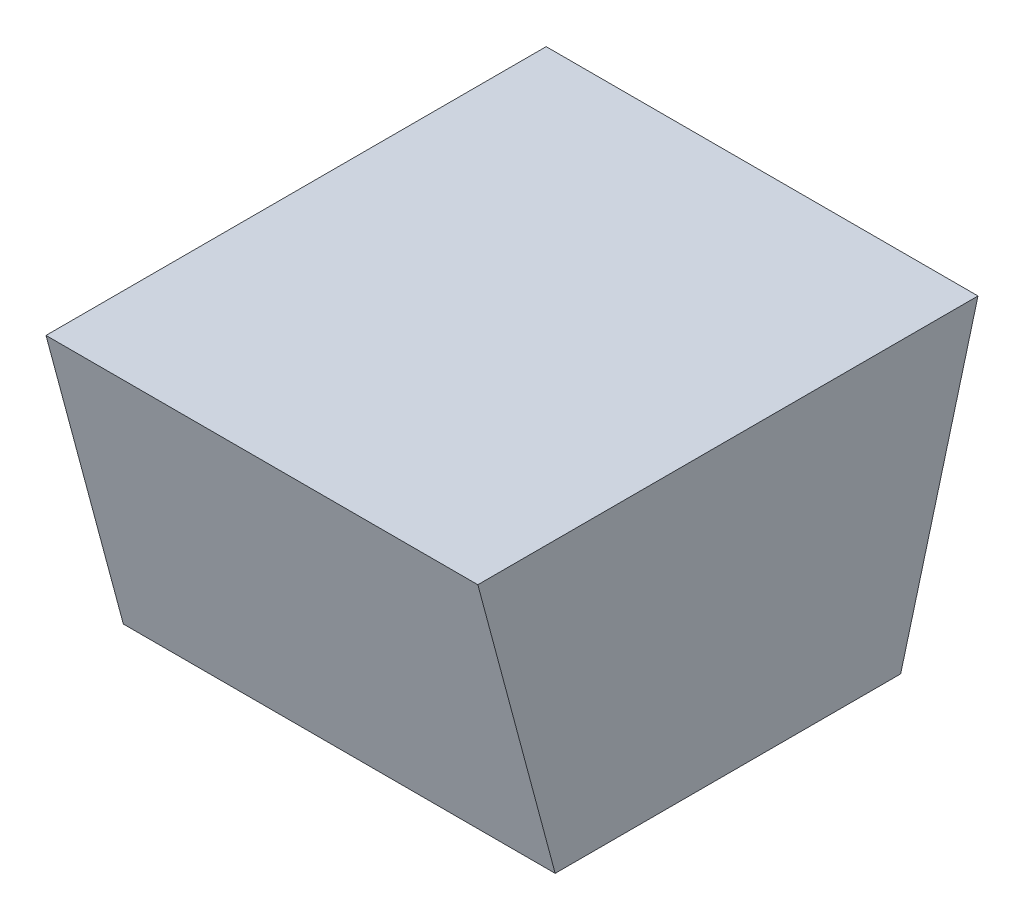
ISO-10303-21;
HEADER;
FILE_DESCRIPTION(('STEP AP214'),'2;1');
FILE_NAME('part.step','',(''),(''),'','','');
FILE_SCHEMA(('AUTOMOTIVE_DESIGN { 1 0 10303 214 1 1 1 1 }'));
ENDSEC;
DATA;
#1=APPLICATION_CONTEXT('core data for automotive mechanical design processes');
#2=APPLICATION_PROTOCOL_DEFINITION('international standard','automotive_design',2000,#1);
#3=PRODUCT_CONTEXT('',#1,'mechanical');
#4=PRODUCT('Part','Part','',(#3));
#5=PRODUCT_RELATED_PRODUCT_CATEGORY('part','',(#4));
#6=PRODUCT_DEFINITION_FORMATION('','',#4);
#7=PRODUCT_DEFINITION_CONTEXT('part definition',#1,'design');
#8=PRODUCT_DEFINITION('design','',#6,#7);
#9=PRODUCT_DEFINITION_SHAPE('','',#8);
#10=(LENGTH_UNIT() NAMED_UNIT(*) SI_UNIT(.MILLI.,.METRE.));
#11=(NAMED_UNIT(*) PLANE_ANGLE_UNIT() SI_UNIT($,.RADIAN.));
#12=(NAMED_UNIT(*) SI_UNIT($,.STERADIAN.) SOLID_ANGLE_UNIT());
#13=UNCERTAINTY_MEASURE_WITH_UNIT(LENGTH_MEASURE(1.E-05),#10,'distance_accuracy_value','');
#14=(GEOMETRIC_REPRESENTATION_CONTEXT(3) GLOBAL_UNCERTAINTY_ASSIGNED_CONTEXT((#13)) GLOBAL_UNIT_ASSIGNED_CONTEXT((#10,
#11,#12)) REPRESENTATION_CONTEXT('',''));
#15=CARTESIAN_POINT('',(0.,0.,0.));
#16=DIRECTION('',(0.,0.,1.));
#17=DIRECTION('',(1.,0.,0.));
#18=AXIS2_PLACEMENT_3D('',#15,#16,#17);
#19=CARTESIAN_POINT('',(0.,0.835526315789467,0.));
#20=DIRECTION('',(0.,1.,0.));
#21=DIRECTION('',(0.,0.,1.));
#22=AXIS2_PLACEMENT_3D('',#19,#20,#21);
#23=PLANE('',#22);
#24=DIRECTION('',(0.,0.,-1.));
#25=VECTOR('',#24,1.);
#26=CARTESIAN_POINT('',(-0.202499976,0.835526315789467,2.007499922));
#27=LINE('',#26,#25);
#28=CARTESIAN_POINT('',(-0.202499976,0.835526315789467,0.72387861757074));
#29=VERTEX_POINT('',#28);
#30=CARTESIAN_POINT('',(-0.202499976,0.835526315789467,-0.72387861757074));
#31=VERTEX_POINT('',#30);
#32=EDGE_CURVE('E101',#29,#31,#27,.T.);
#33=ORIENTED_EDGE('',*,*,#32,.F.);
#34=DIRECTION('',(-1.,0.,0.));
#35=VECTOR('',#34,1.);
#36=CARTESIAN_POINT('',(2.007499922,0.835526315789467,0.72387861757074));
#37=LINE('',#36,#35);
#38=CARTESIAN_POINT('',(1.047500064,0.835526315789467,0.72387861757074));
#39=VERTEX_POINT('',#38);
#40=EDGE_CURVE('E57',#39,#29,#37,.T.);
#41=ORIENTED_EDGE('',*,*,#40,.F.);
#42=DIRECTION('',(0.,0.,1.));
#43=VECTOR('',#42,1.);
#44=CARTESIAN_POINT('',(1.047500064,0.835526315789467,2.007499922));
#45=LINE('',#44,#43);
#46=CARTESIAN_POINT('',(1.047500064,0.835526315789467,-0.72387861757074));
#47=VERTEX_POINT('',#46);
#48=EDGE_CURVE('E12',#47,#39,#45,.T.);
#49=ORIENTED_EDGE('',*,*,#48,.F.);
#50=DIRECTION('',(1.,0.,0.));
#51=VECTOR('',#50,1.);
#52=CARTESIAN_POINT('',(2.007499922,0.835526315789467,-0.72387861757074));
#53=LINE('',#52,#51);
#54=EDGE_CURVE('E81',#31,#47,#53,.T.);
#55=ORIENTED_EDGE('',*,*,#54,.F.);
#56=EDGE_LOOP('',(#33,#41,#49,#55));
#57=FACE_BOUND('',#56,.T.);
#58=ADVANCED_FACE('F42',(#57),#23,.T.);
#59=CARTESIAN_POINT('',(2.007499922,0.,0.500000016));
#60=DIRECTION('',(0.,-0.258819045102522,0.965925826289068));
#61=DIRECTION('',(0.,-0.965925826289068,-0.258819045102522));
#62=AXIS2_PLACEMENT_3D('',#59,#60,#61);
#63=PLANE('',#62);
#64=DIRECTION('',(0.,0.965925826289068,0.258819045102522));
#65=VECTOR('',#64,1.);
#66=CARTESIAN_POINT('',(1.047500064,0.,0.500000016));
#67=LINE('',#66,#65);
#68=CARTESIAN_POINT('',(1.047500064,0.,0.500000016));
#69=VERTEX_POINT('',#68);
#70=EDGE_CURVE('E97',#69,#39,#67,.T.);
#71=ORIENTED_EDGE('',*,*,#70,.T.);
#72=ORIENTED_EDGE('',*,*,#40,.T.);
#73=DIRECTION('',(0.,-0.965925826289068,-0.258819045102522));
#74=VECTOR('',#73,1.);
#75=CARTESIAN_POINT('',(-0.202499976,0.,0.500000016));
#76=LINE('',#75,#74);
#77=CARTESIAN_POINT('',(-0.202499976,0.,0.500000016));
#78=VERTEX_POINT('',#77);
#79=EDGE_CURVE('E108',#29,#78,#76,.T.);
#80=ORIENTED_EDGE('',*,*,#79,.T.);
#81=DIRECTION('',(-1.,0.,0.));
#82=VECTOR('',#81,1.);
#83=CARTESIAN_POINT('',(2.007499922,0.,0.500000016));
#84=LINE('',#83,#82);
#85=EDGE_CURVE('E64',#69,#78,#84,.T.);
#86=ORIENTED_EDGE('',*,*,#85,.F.);
#87=EDGE_LOOP('',(#71,#72,#80,#86));
#88=FACE_BOUND('',#87,.T.);
#89=ADVANCED_FACE('F121',(#88),#63,.T.);
#90=CARTESIAN_POINT('',(2.007499922,0.,-0.500000016));
#91=DIRECTION('',(0.,-0.258819045102522,-0.965925826289068));
#92=DIRECTION('',(0.,0.965925826289068,-0.258819045102522));
#93=AXIS2_PLACEMENT_3D('',#90,#91,#92);
#94=PLANE('',#93);
#95=DIRECTION('',(0.,0.965925826289068,-0.258819045102522));
#96=VECTOR('',#95,1.);
#97=CARTESIAN_POINT('',(-0.202499976,0.,-0.500000016));
#98=LINE('',#97,#96);
#99=CARTESIAN_POINT('',(-0.202499976,0.,-0.500000016));
#100=VERTEX_POINT('',#99);
#101=EDGE_CURVE('E91',#100,#31,#98,.T.);
#102=ORIENTED_EDGE('',*,*,#101,.T.);
#103=ORIENTED_EDGE('',*,*,#54,.T.);
#104=DIRECTION('',(0.,-0.965925826289068,0.258819045102522));
#105=VECTOR('',#104,1.);
#106=CARTESIAN_POINT('',(1.047500064,0.,-0.500000016));
#107=LINE('',#106,#105);
#108=CARTESIAN_POINT('',(1.047500064,0.,-0.500000016));
#109=VERTEX_POINT('',#108);
#110=EDGE_CURVE('E88',#47,#109,#107,.T.);
#111=ORIENTED_EDGE('',*,*,#110,.T.);
#112=DIRECTION('',(-1.,0.,0.));
#113=VECTOR('',#112,1.);
#114=CARTESIAN_POINT('',(2.007499922,0.,-0.500000016));
#115=LINE('',#114,#113);
#116=EDGE_CURVE('E50',#109,#100,#115,.T.);
#117=ORIENTED_EDGE('',*,*,#116,.T.);
#118=EDGE_LOOP('',(#102,#103,#111,#117));
#119=FACE_BOUND('',#118,.T.);
#120=ADVANCED_FACE('F87',(#119),#94,.T.);
#121=CARTESIAN_POINT('',(-0.202499976,1.61600007,2.007499922));
#122=DIRECTION('',(-1.,0.,0.));
#123=DIRECTION('',(0.,-1.,0.));
#124=AXIS2_PLACEMENT_3D('',#121,#122,#123);
#125=PLANE('',#124);
#126=ORIENTED_EDGE('',*,*,#79,.F.);
#127=ORIENTED_EDGE('',*,*,#32,.T.);
#128=ORIENTED_EDGE('',*,*,#101,.F.);
#129=DIRECTION('',(0.,0.,-1.));
#130=VECTOR('',#129,1.);
#131=CARTESIAN_POINT('',(-0.202499976,0.,0.500000016));
#132=LINE('',#131,#130);
#133=EDGE_CURVE('E99',#78,#100,#132,.T.);
#134=ORIENTED_EDGE('',*,*,#133,.F.);
#135=EDGE_LOOP('',(#126,#127,#128,#134));
#136=FACE_BOUND('',#135,.T.);
#137=ADVANCED_FACE('F114',(#136),#125,.T.);
#138=CARTESIAN_POINT('',(1.047500064,-0.00999998,2.007499922));
#139=DIRECTION('',(1.,0.,0.));
#140=DIRECTION('',(0.,0.,-1.));
#141=AXIS2_PLACEMENT_3D('',#138,#139,#140);
#142=PLANE('',#141);
#143=ORIENTED_EDGE('',*,*,#110,.F.);
#144=ORIENTED_EDGE('',*,*,#48,.T.);
#145=ORIENTED_EDGE('',*,*,#70,.F.);
#146=DIRECTION('',(0.,0.,1.));
#147=VECTOR('',#146,1.);
#148=CARTESIAN_POINT('',(1.047500064,0.,0.500000016));
#149=LINE('',#148,#147);
#150=EDGE_CURVE('E95',#109,#69,#149,.T.);
#151=ORIENTED_EDGE('',*,*,#150,.F.);
#152=EDGE_LOOP('',(#143,#144,#145,#151));
#153=FACE_BOUND('',#152,.T.);
#154=ADVANCED_FACE('F93',(#153),#142,.T.);
#155=CARTESIAN_POINT('',(0.,0.,0.));
#156=DIRECTION('',(0.,1.,0.));
#157=DIRECTION('',(0.,0.,1.));
#158=AXIS2_PLACEMENT_3D('',#155,#156,#157);
#159=PLANE('',#158);
#160=ORIENTED_EDGE('',*,*,#133,.T.);
#161=ORIENTED_EDGE('',*,*,#116,.F.);
#162=ORIENTED_EDGE('',*,*,#150,.T.);
#163=ORIENTED_EDGE('',*,*,#85,.T.);
#164=EDGE_LOOP('',(#160,#161,#162,#163));
#165=FACE_BOUND('',#164,.T.);
#166=ADVANCED_FACE('F44',(#165),#159,.F.);
#167=CLOSED_SHELL('',(#58,#89,#120,#137,#154,#166));
#168=MANIFOLD_SOLID_BREP('B2',#167);
#169=ADVANCED_BREP_SHAPE_REPRESENTATION('',(#18,#168),#14);
#170=SHAPE_DEFINITION_REPRESENTATION(#9,#169);
ENDSEC;
END-ISO-10303-21;
